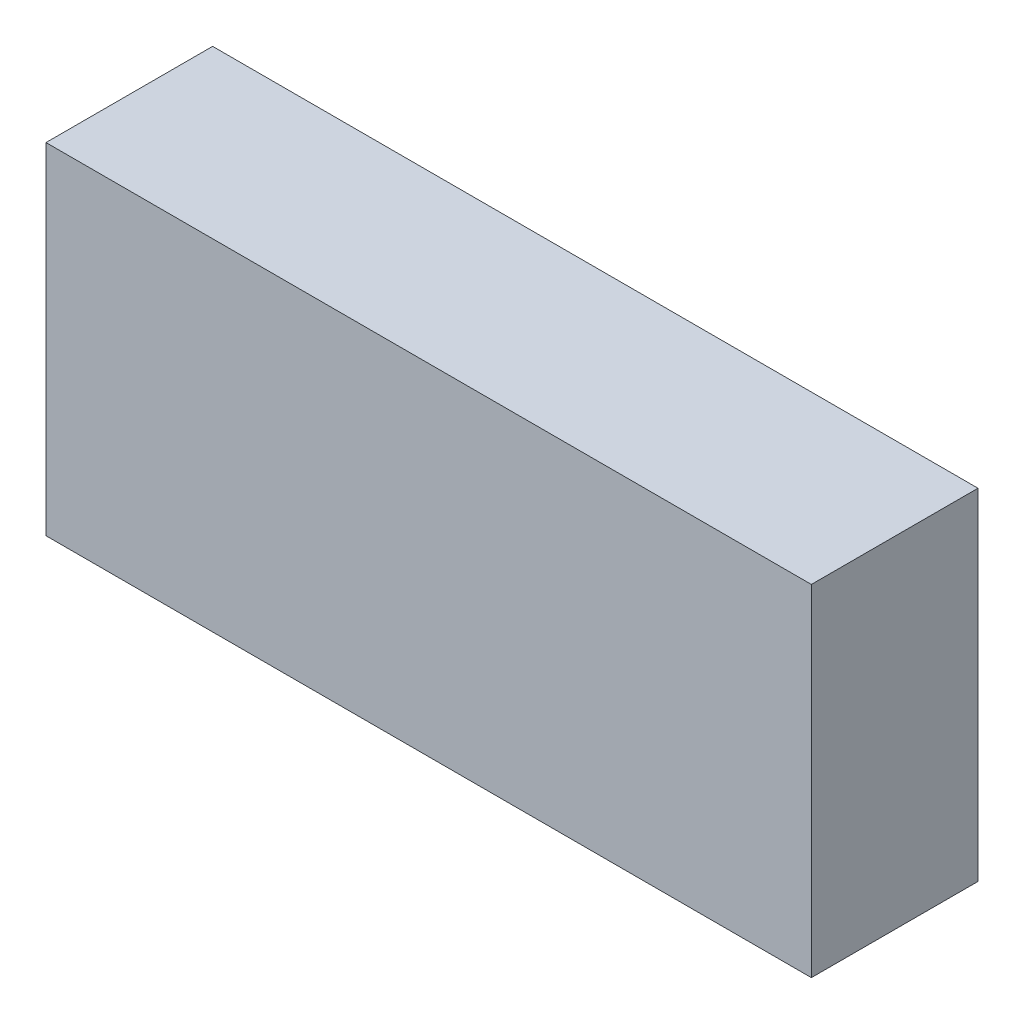
ISO-10303-21;
HEADER;
FILE_DESCRIPTION(('STEP AP214'),'2;1');
FILE_NAME('part.step','',(''),(''),'','','');
FILE_SCHEMA(('AUTOMOTIVE_DESIGN { 1 0 10303 214 1 1 1 1 }'));
ENDSEC;
DATA;
#1=APPLICATION_CONTEXT('core data for automotive mechanical design processes');
#2=APPLICATION_PROTOCOL_DEFINITION('international standard','automotive_design',2000,#1);
#3=PRODUCT_CONTEXT('',#1,'mechanical');
#4=PRODUCT('Part','Part','',(#3));
#5=PRODUCT_RELATED_PRODUCT_CATEGORY('part','',(#4));
#6=PRODUCT_DEFINITION_FORMATION('','',#4);
#7=PRODUCT_DEFINITION_CONTEXT('part definition',#1,'design');
#8=PRODUCT_DEFINITION('design','',#6,#7);
#9=PRODUCT_DEFINITION_SHAPE('','',#8);
#10=(LENGTH_UNIT() NAMED_UNIT(*) SI_UNIT(.MILLI.,.METRE.));
#11=(NAMED_UNIT(*) PLANE_ANGLE_UNIT() SI_UNIT($,.RADIAN.));
#12=(NAMED_UNIT(*) SI_UNIT($,.STERADIAN.) SOLID_ANGLE_UNIT());
#13=UNCERTAINTY_MEASURE_WITH_UNIT(LENGTH_MEASURE(1.E-05),#10,'distance_accuracy_value','');
#14=(GEOMETRIC_REPRESENTATION_CONTEXT(3) GLOBAL_UNCERTAINTY_ASSIGNED_CONTEXT((#13)) GLOBAL_UNIT_ASSIGNED_CONTEXT((#10,
#11,#12)) REPRESENTATION_CONTEXT('',''));
#15=CARTESIAN_POINT('',(0.,0.,0.));
#16=DIRECTION('',(0.,0.,1.));
#17=DIRECTION('',(1.,0.,0.));
#18=AXIS2_PLACEMENT_3D('',#15,#16,#17);
#19=CARTESIAN_POINT('',(0.,0.,10.));
#20=DIRECTION('',(1.,0.,0.));
#21=DIRECTION('',(0.,0.,-1.));
#22=AXIS2_PLACEMENT_3D('',#19,#20,#21);
#23=PLANE('',#22);
#24=DIRECTION('',(0.,-1.,0.));
#25=VECTOR('',#24,1.);
#26=CARTESIAN_POINT('',(0.,0.,0.));
#27=LINE('',#26,#25);
#28=CARTESIAN_POINT('',(0.,0.,0.));
#29=VERTEX_POINT('',#28);
#30=CARTESIAN_POINT('',(0.,-20.4371359223301,0.));
#31=VERTEX_POINT('',#30);
#32=EDGE_CURVE('E104',#29,#31,#27,.T.);
#33=ORIENTED_EDGE('',*,*,#32,.T.);
#34=DIRECTION('',(0.,0.,-1.));
#35=VECTOR('',#34,1.);
#36=CARTESIAN_POINT('',(0.,-20.4371359223301,10.));
#37=LINE('',#36,#35);
#38=CARTESIAN_POINT('',(0.,-20.4371359223301,10.));
#39=VERTEX_POINT('',#38);
#40=EDGE_CURVE('E11',#39,#31,#37,.T.);
#41=ORIENTED_EDGE('',*,*,#40,.F.);
#42=DIRECTION('',(0.,-1.,0.));
#43=VECTOR('',#42,1.);
#44=CARTESIAN_POINT('',(0.,0.,10.));
#45=LINE('',#44,#43);
#46=CARTESIAN_POINT('',(0.,0.,10.));
#47=VERTEX_POINT('',#46);
#48=EDGE_CURVE('E92',#47,#39,#45,.T.);
#49=ORIENTED_EDGE('',*,*,#48,.F.);
#50=DIRECTION('',(0.,0.,-1.));
#51=VECTOR('',#50,1.);
#52=CARTESIAN_POINT('',(0.,0.,10.));
#53=LINE('',#52,#51);
#54=EDGE_CURVE('E100',#47,#29,#53,.T.);
#55=ORIENTED_EDGE('',*,*,#54,.T.);
#56=EDGE_LOOP('',(#33,#41,#49,#55));
#57=FACE_BOUND('',#56,.T.);
#58=ADVANCED_FACE('F41',(#57),#23,.F.);
#59=CARTESIAN_POINT('',(0.,-20.4371359223301,10.));
#60=DIRECTION('',(0.,1.,0.));
#61=DIRECTION('',(0.,0.,1.));
#62=AXIS2_PLACEMENT_3D('',#59,#60,#61);
#63=PLANE('',#62);
#64=DIRECTION('',(1.,0.,0.));
#65=VECTOR('',#64,1.);
#66=CARTESIAN_POINT('',(0.,-20.4371359223301,0.));
#67=LINE('',#66,#65);
#68=CARTESIAN_POINT('',(45.9319288099608,-20.4371359223301,0.));
#69=VERTEX_POINT('',#68);
#70=EDGE_CURVE('E96',#31,#69,#67,.T.);
#71=ORIENTED_EDGE('',*,*,#70,.T.);
#72=DIRECTION('',(0.,0.,-1.));
#73=VECTOR('',#72,1.);
#74=CARTESIAN_POINT('',(45.9319288099608,-20.4371359223301,10.));
#75=LINE('',#74,#73);
#76=CARTESIAN_POINT('',(45.9319288099608,-20.4371359223301,10.));
#77=VERTEX_POINT('',#76);
#78=EDGE_CURVE('E49',#77,#69,#75,.T.);
#79=ORIENTED_EDGE('',*,*,#78,.F.);
#80=DIRECTION('',(1.,0.,0.));
#81=VECTOR('',#80,1.);
#82=CARTESIAN_POINT('',(0.,-20.4371359223301,10.));
#83=LINE('',#82,#81);
#84=EDGE_CURVE('E87',#39,#77,#83,.T.);
#85=ORIENTED_EDGE('',*,*,#84,.F.);
#86=ORIENTED_EDGE('',*,*,#40,.T.);
#87=EDGE_LOOP('',(#71,#79,#85,#86));
#88=FACE_BOUND('',#87,.T.);
#89=ADVANCED_FACE('F95',(#88),#63,.F.);
#90=CARTESIAN_POINT('',(45.9319288099608,0.,10.));
#91=DIRECTION('',(-1.,0.,0.));
#92=DIRECTION('',(0.,0.,1.));
#93=AXIS2_PLACEMENT_3D('',#90,#91,#92);
#94=PLANE('',#93);
#95=DIRECTION('',(0.,1.,0.));
#96=VECTOR('',#95,1.);
#97=CARTESIAN_POINT('',(45.9319288099608,0.,0.));
#98=LINE('',#97,#96);
#99=CARTESIAN_POINT('',(45.9319288099608,0.,0.));
#100=VERTEX_POINT('',#99);
#101=EDGE_CURVE('E74',#69,#100,#98,.T.);
#102=ORIENTED_EDGE('',*,*,#101,.T.);
#103=DIRECTION('',(0.,0.,-1.));
#104=VECTOR('',#103,1.);
#105=CARTESIAN_POINT('',(45.9319288099608,0.,10.));
#106=LINE('',#105,#104);
#107=CARTESIAN_POINT('',(45.9319288099608,0.,10.));
#108=VERTEX_POINT('',#107);
#109=EDGE_CURVE('E97',#108,#100,#106,.T.);
#110=ORIENTED_EDGE('',*,*,#109,.F.);
#111=DIRECTION('',(0.,1.,0.));
#112=VECTOR('',#111,1.);
#113=CARTESIAN_POINT('',(45.9319288099608,0.,10.));
#114=LINE('',#113,#112);
#115=EDGE_CURVE('E90',#77,#108,#114,.T.);
#116=ORIENTED_EDGE('',*,*,#115,.F.);
#117=ORIENTED_EDGE('',*,*,#78,.T.);
#118=EDGE_LOOP('',(#102,#110,#116,#117));
#119=FACE_BOUND('',#118,.T.);
#120=ADVANCED_FACE('F98',(#119),#94,.F.);
#121=CARTESIAN_POINT('',(0.,0.,10.));
#122=DIRECTION('',(0.,-1.,0.));
#123=DIRECTION('',(0.,0.,-1.));
#124=AXIS2_PLACEMENT_3D('',#121,#122,#123);
#125=PLANE('',#124);
#126=DIRECTION('',(-1.,0.,0.));
#127=VECTOR('',#126,1.);
#128=CARTESIAN_POINT('',(0.,0.,0.));
#129=LINE('',#128,#127);
#130=EDGE_CURVE('E80',#100,#29,#129,.T.);
#131=ORIENTED_EDGE('',*,*,#130,.T.);
#132=ORIENTED_EDGE('',*,*,#54,.F.);
#133=DIRECTION('',(-1.,0.,0.));
#134=VECTOR('',#133,1.);
#135=CARTESIAN_POINT('',(0.,0.,10.));
#136=LINE('',#135,#134);
#137=EDGE_CURVE('E57',#108,#47,#136,.T.);
#138=ORIENTED_EDGE('',*,*,#137,.F.);
#139=ORIENTED_EDGE('',*,*,#109,.T.);
#140=EDGE_LOOP('',(#131,#132,#138,#139));
#141=FACE_BOUND('',#140,.T.);
#142=ADVANCED_FACE('F111',(#141),#125,.F.);
#143=CARTESIAN_POINT('',(0.,0.,10.));
#144=DIRECTION('',(0.,0.,1.));
#145=DIRECTION('',(1.,0.,0.));
#146=AXIS2_PLACEMENT_3D('',#143,#144,#145);
#147=PLANE('',#146);
#148=ORIENTED_EDGE('',*,*,#48,.T.);
#149=ORIENTED_EDGE('',*,*,#84,.T.);
#150=ORIENTED_EDGE('',*,*,#115,.T.);
#151=ORIENTED_EDGE('',*,*,#137,.T.);
#152=EDGE_LOOP('',(#148,#149,#150,#151));
#153=FACE_BOUND('',#152,.T.);
#154=ADVANCED_FACE('F88',(#153),#147,.T.);
#155=CARTESIAN_POINT('',(0.,0.,0.));
#156=DIRECTION('',(0.,0.,1.));
#157=DIRECTION('',(1.,0.,0.));
#158=AXIS2_PLACEMENT_3D('',#155,#156,#157);
#159=PLANE('',#158);
#160=ORIENTED_EDGE('',*,*,#32,.F.);
#161=ORIENTED_EDGE('',*,*,#130,.F.);
#162=ORIENTED_EDGE('',*,*,#101,.F.);
#163=ORIENTED_EDGE('',*,*,#70,.F.);
#164=EDGE_LOOP('',(#160,#161,#162,#163));
#165=FACE_BOUND('',#164,.T.);
#166=ADVANCED_FACE('F114',(#165),#159,.F.);
#167=CLOSED_SHELL('',(#58,#89,#120,#142,#154,#166));
#168=MANIFOLD_SOLID_BREP('B2',#167);
#169=ADVANCED_BREP_SHAPE_REPRESENTATION('',(#18,#168),#14);
#170=SHAPE_DEFINITION_REPRESENTATION(#9,#169);
ENDSEC;
END-ISO-10303-21;
